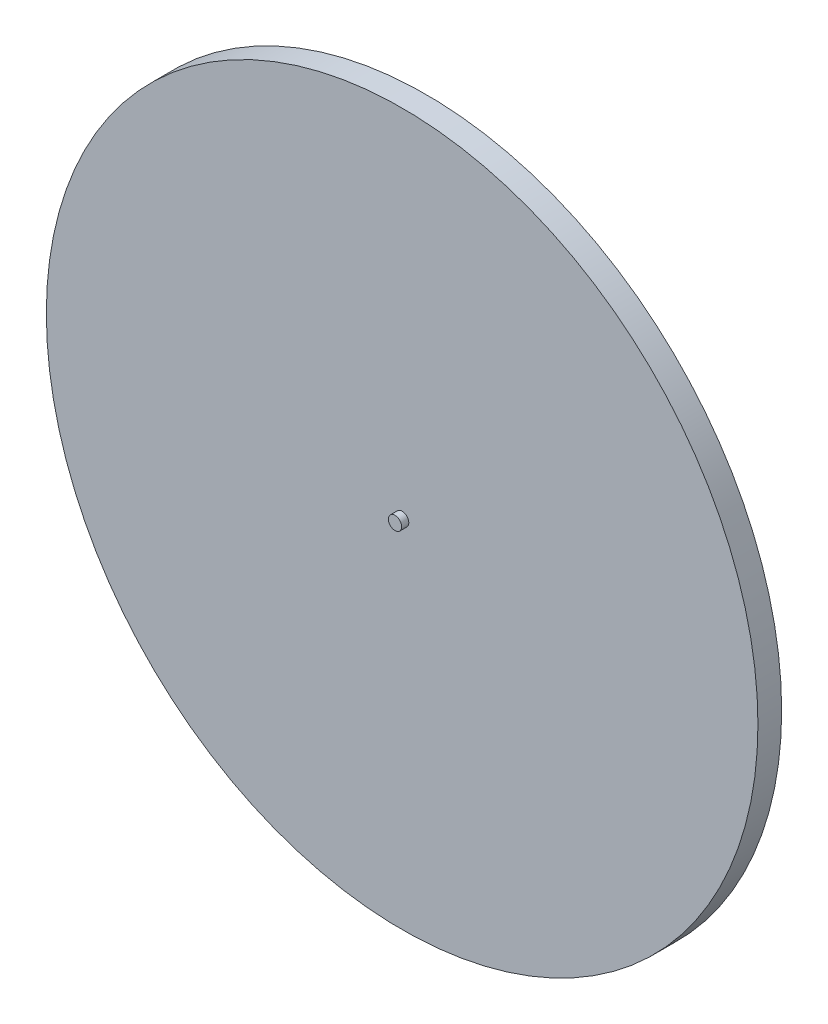
ISO-10303-21;
HEADER;
FILE_DESCRIPTION(('STEP AP214'),'2;1');
FILE_NAME('part.step','',(''),(''),'','','');
FILE_SCHEMA(('AUTOMOTIVE_DESIGN { 1 0 10303 214 1 1 1 1 }'));
ENDSEC;
DATA;
#1=APPLICATION_CONTEXT('core data for automotive mechanical design processes');
#2=APPLICATION_PROTOCOL_DEFINITION('international standard','automotive_design',2000,#1);
#3=PRODUCT_CONTEXT('',#1,'mechanical');
#4=PRODUCT('Part','Part','',(#3));
#5=PRODUCT_RELATED_PRODUCT_CATEGORY('part','',(#4));
#6=PRODUCT_DEFINITION_FORMATION('','',#4);
#7=PRODUCT_DEFINITION_CONTEXT('part definition',#1,'design');
#8=PRODUCT_DEFINITION('design','',#6,#7);
#9=PRODUCT_DEFINITION_SHAPE('','',#8);
#10=(LENGTH_UNIT() NAMED_UNIT(*) SI_UNIT(.MILLI.,.METRE.));
#11=(NAMED_UNIT(*) PLANE_ANGLE_UNIT() SI_UNIT($,.RADIAN.));
#12=(NAMED_UNIT(*) SI_UNIT($,.STERADIAN.) SOLID_ANGLE_UNIT());
#13=UNCERTAINTY_MEASURE_WITH_UNIT(LENGTH_MEASURE(1.E-05),#10,'distance_accuracy_value','');
#14=(GEOMETRIC_REPRESENTATION_CONTEXT(3) GLOBAL_UNCERTAINTY_ASSIGNED_CONTEXT((#13)) GLOBAL_UNIT_ASSIGNED_CONTEXT((#10,
#11,#12)) REPRESENTATION_CONTEXT('',''));
#15=CARTESIAN_POINT('',(0.,0.,0.));
#16=DIRECTION('',(0.,0.,1.));
#17=DIRECTION('',(1.,0.,0.));
#18=AXIS2_PLACEMENT_3D('',#15,#16,#17);
#19=CARTESIAN_POINT('',(0.,0.,3.));
#20=DIRECTION('',(0.,0.,-1.));
#21=DIRECTION('',(-1.,0.,0.));
#22=AXIS2_PLACEMENT_3D('',#19,#20,#21);
#23=CYLINDRICAL_SURFACE('',#22,2.8);
#24=CARTESIAN_POINT('',(0.,0.,3.));
#25=DIRECTION('',(0.,0.,1.));
#26=DIRECTION('',(1.,0.,0.));
#27=AXIS2_PLACEMENT_3D('',#24,#25,#26);
#28=CIRCLE('',#27,2.8);
#29=CARTESIAN_POINT('',(2.8,0.,3.));
#30=VERTEX_POINT('',#29);
#31=EDGE_CURVE('E10',#30,#30,#28,.T.);
#32=ORIENTED_EDGE('',*,*,#31,.F.);
#33=EDGE_LOOP('',(#32));
#34=FACE_BOUND('',#33,.T.);
#35=CARTESIAN_POINT('',(0.,0.,0.));
#36=DIRECTION('',(0.,0.,1.));
#37=DIRECTION('',(1.,0.,0.));
#38=AXIS2_PLACEMENT_3D('',#35,#36,#37);
#39=CIRCLE('',#38,2.8);
#40=CARTESIAN_POINT('',(2.8,0.,0.));
#41=VERTEX_POINT('',#40);
#42=EDGE_CURVE('E40',#41,#41,#39,.T.);
#43=ORIENTED_EDGE('',*,*,#42,.T.);
#44=EDGE_LOOP('',(#43));
#45=FACE_BOUND('',#44,.T.);
#46=ADVANCED_FACE('F37',(#34,#45),#23,.T.);
#47=CARTESIAN_POINT('',(0.,0.,3.));
#48=DIRECTION('',(0.,0.,1.));
#49=DIRECTION('',(1.,0.,0.));
#50=AXIS2_PLACEMENT_3D('',#47,#48,#49);
#51=PLANE('',#50);
#52=ORIENTED_EDGE('',*,*,#31,.T.);
#53=EDGE_LOOP('',(#52));
#54=FACE_BOUND('',#53,.T.);
#55=ADVANCED_FACE('F60',(#54),#51,.T.);
#56=CARTESIAN_POINT('',(0.,0.,-10.));
#57=DIRECTION('',(0.,0.,1.));
#58=DIRECTION('',(1.,0.,0.));
#59=AXIS2_PLACEMENT_3D('',#56,#57,#58);
#60=CYLINDRICAL_SURFACE('',#59,150.);
#61=CARTESIAN_POINT('',(0.,0.,-10.));
#62=DIRECTION('',(0.,0.,-1.));
#63=DIRECTION('',(-1.,0.,0.));
#64=AXIS2_PLACEMENT_3D('',#61,#62,#63);
#65=CIRCLE('',#64,150.);
#66=CARTESIAN_POINT('',(-150.,0.,-10.));
#67=VERTEX_POINT('',#66);
#68=EDGE_CURVE('E47',#67,#67,#65,.T.);
#69=ORIENTED_EDGE('',*,*,#68,.F.);
#70=EDGE_LOOP('',(#69));
#71=FACE_BOUND('',#70,.T.);
#72=CARTESIAN_POINT('',(0.,0.,0.));
#73=DIRECTION('',(0.,0.,-1.));
#74=DIRECTION('',(-1.,0.,0.));
#75=AXIS2_PLACEMENT_3D('',#72,#73,#74);
#76=CIRCLE('',#75,150.);
#77=CARTESIAN_POINT('',(-150.,0.,0.));
#78=VERTEX_POINT('',#77);
#79=EDGE_CURVE('E49',#78,#78,#76,.T.);
#80=ORIENTED_EDGE('',*,*,#79,.T.);
#81=EDGE_LOOP('',(#80));
#82=FACE_BOUND('',#81,.T.);
#83=ADVANCED_FACE('F57',(#71,#82),#60,.T.);
#84=CARTESIAN_POINT('',(0.,0.,-10.));
#85=DIRECTION('',(0.,0.,-1.));
#86=DIRECTION('',(-1.,0.,0.));
#87=AXIS2_PLACEMENT_3D('',#84,#85,#86);
#88=PLANE('',#87);
#89=ORIENTED_EDGE('',*,*,#68,.T.);
#90=EDGE_LOOP('',(#89));
#91=FACE_BOUND('',#90,.T.);
#92=ADVANCED_FACE('F55',(#91),#88,.T.);
#93=CARTESIAN_POINT('',(0.,0.,0.));
#94=DIRECTION('',(0.,0.,-1.));
#95=DIRECTION('',(-1.,0.,0.));
#96=AXIS2_PLACEMENT_3D('',#93,#94,#95);
#97=PLANE('',#96);
#98=ORIENTED_EDGE('',*,*,#42,.F.);
#99=EDGE_LOOP('',(#98));
#100=FACE_BOUND('',#99,.T.);
#101=ORIENTED_EDGE('',*,*,#79,.F.);
#102=EDGE_LOOP('',(#101));
#103=FACE_BOUND('',#102,.T.);
#104=ADVANCED_FACE('F64',(#100,#103),#97,.F.);
#105=CLOSED_SHELL('',(#46,#55,#83,#92,#104));
#106=MANIFOLD_SOLID_BREP('B2',#105);
#107=ADVANCED_BREP_SHAPE_REPRESENTATION('',(#18,#106),#14);
#108=SHAPE_DEFINITION_REPRESENTATION(#9,#107);
ENDSEC;
END-ISO-10303-21;
